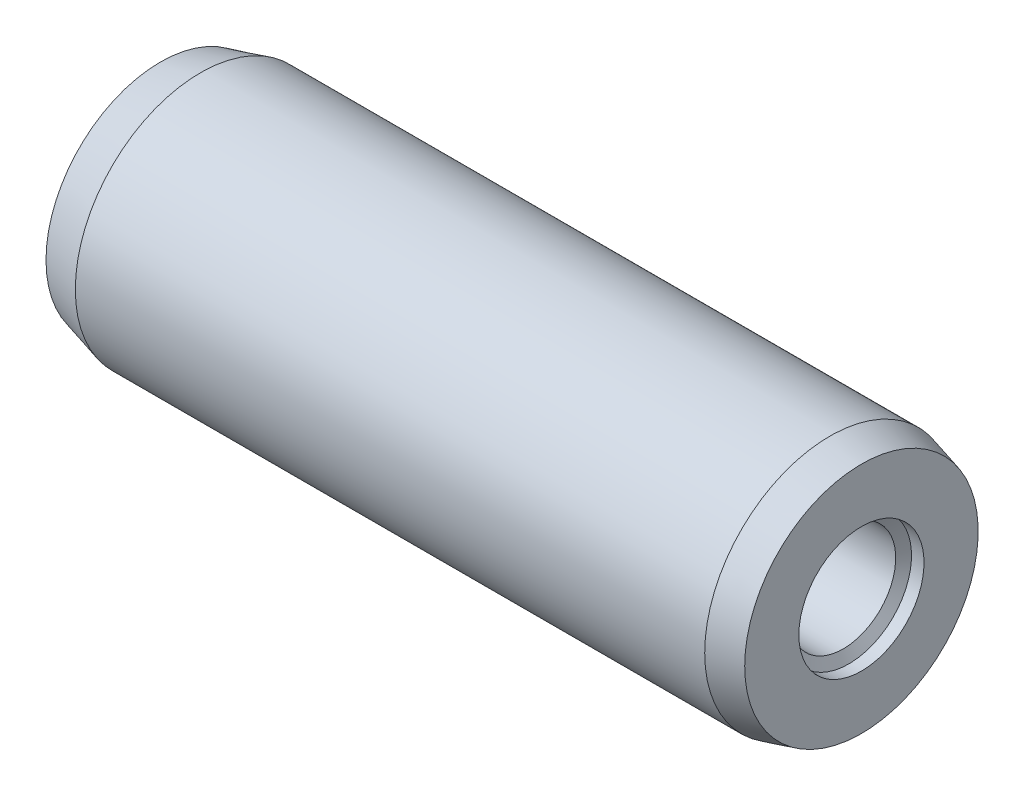
ISO-10303-21;
HEADER;
FILE_DESCRIPTION(('STEP AP214'),'2;1');
FILE_NAME('part.step','',(''),(''),'','','');
FILE_SCHEMA(('AUTOMOTIVE_DESIGN { 1 0 10303 214 1 1 1 1 }'));
ENDSEC;
DATA;
#1=APPLICATION_CONTEXT('core data for automotive mechanical design processes');
#2=APPLICATION_PROTOCOL_DEFINITION('international standard','automotive_design',2000,#1);
#3=PRODUCT_CONTEXT('',#1,'mechanical');
#4=PRODUCT('Part','Part','',(#3));
#5=PRODUCT_RELATED_PRODUCT_CATEGORY('part','',(#4));
#6=PRODUCT_DEFINITION_FORMATION('','',#4);
#7=PRODUCT_DEFINITION_CONTEXT('part definition',#1,'design');
#8=PRODUCT_DEFINITION('design','',#6,#7);
#9=PRODUCT_DEFINITION_SHAPE('','',#8);
#10=(LENGTH_UNIT() NAMED_UNIT(*) SI_UNIT(.MILLI.,.METRE.));
#11=(NAMED_UNIT(*) PLANE_ANGLE_UNIT() SI_UNIT($,.RADIAN.));
#12=(NAMED_UNIT(*) SI_UNIT($,.STERADIAN.) SOLID_ANGLE_UNIT());
#13=UNCERTAINTY_MEASURE_WITH_UNIT(LENGTH_MEASURE(1.E-05),#10,'distance_accuracy_value','');
#14=(GEOMETRIC_REPRESENTATION_CONTEXT(3) GLOBAL_UNCERTAINTY_ASSIGNED_CONTEXT((#13)) GLOBAL_UNIT_ASSIGNED_CONTEXT((#10,
#11,#12)) REPRESENTATION_CONTEXT('',''));
#15=CARTESIAN_POINT('',(0.,0.,0.));
#16=DIRECTION('',(0.,0.,1.));
#17=DIRECTION('',(1.,0.,0.));
#18=AXIS2_PLACEMENT_3D('',#15,#16,#17);
#19=CARTESIAN_POINT('',(0.,0.,0.));
#20=DIRECTION('',(1.,0.,0.));
#21=DIRECTION('',(0.,0.,-1.));
#22=AXIS2_PLACEMENT_3D('',#19,#20,#21);
#23=PLANE('',#22);
#24=CARTESIAN_POINT('',(0.,0.,0.));
#25=DIRECTION('',(-1.,0.,0.));
#26=DIRECTION('',(0.,0.,1.));
#27=AXIS2_PLACEMENT_3D('',#24,#25,#26);
#28=CIRCLE('',#27,22.8564064605511);
#29=CARTESIAN_POINT('',(0.,0.,22.8564064605511));
#30=VERTEX_POINT('',#29);
#31=EDGE_CURVE('E11',#30,#30,#28,.T.);
#32=ORIENTED_EDGE('',*,*,#31,.T.);
#33=EDGE_LOOP('',(#32));
#34=FACE_BOUND('',#33,.T.);
#35=ADVANCED_FACE('F34',(#34),#23,.F.);
#36=CARTESIAN_POINT('',(8.,0.,0.));
#37=DIRECTION('',(1.,0.,0.));
#38=DIRECTION('',(0.,0.,-1.));
#39=AXIS2_PLACEMENT_3D('',#36,#37,#38);
#40=CONICAL_SURFACE('',#39,25.,0.261799387799143);
#41=ORIENTED_EDGE('',*,*,#31,.F.);
#42=EDGE_LOOP('',(#41));
#43=FACE_BOUND('',#42,.T.);
#44=CARTESIAN_POINT('',(8.,0.,0.));
#45=DIRECTION('',(-1.,0.,0.));
#46=DIRECTION('',(0.,0.,1.));
#47=AXIS2_PLACEMENT_3D('',#44,#45,#46);
#48=CIRCLE('',#47,25.);
#49=CARTESIAN_POINT('',(8.,0.,25.));
#50=VERTEX_POINT('',#49);
#51=EDGE_CURVE('E40',#50,#50,#48,.T.);
#52=ORIENTED_EDGE('',*,*,#51,.T.);
#53=EDGE_LOOP('',(#52));
#54=FACE_BOUND('',#53,.T.);
#55=ADVANCED_FACE('F56',(#43,#54),#40,.T.);
#56=CARTESIAN_POINT('',(-10.,0.,0.));
#57=DIRECTION('',(-1.,0.,0.));
#58=DIRECTION('',(0.,0.,1.));
#59=AXIS2_PLACEMENT_3D('',#56,#57,#58);
#60=CYLINDRICAL_SURFACE('',#59,25.);
#61=ORIENTED_EDGE('',*,*,#51,.F.);
#62=EDGE_LOOP('',(#61));
#63=FACE_BOUND('',#62,.T.);
#64=CARTESIAN_POINT('',(133.7,0.,0.));
#65=DIRECTION('',(-1.,0.,0.));
#66=DIRECTION('',(0.,0.,1.));
#67=AXIS2_PLACEMENT_3D('',#64,#65,#66);
#68=CIRCLE('',#67,25.);
#69=CARTESIAN_POINT('',(133.7,0.,25.));
#70=VERTEX_POINT('',#69);
#71=EDGE_CURVE('E68',#70,#70,#68,.T.);
#72=ORIENTED_EDGE('',*,*,#71,.T.);
#73=EDGE_LOOP('',(#72));
#74=FACE_BOUND('',#73,.T.);
#75=ADVANCED_FACE('F61',(#63,#74),#60,.T.);
#76=CARTESIAN_POINT('',(140.,0.,0.));
#77=DIRECTION('',(-1.,0.,0.));
#78=DIRECTION('',(0.,0.,1.));
#79=AXIS2_PLACEMENT_3D('',#76,#77,#78);
#80=CONICAL_SURFACE('',#79,23.3119200876839,0.261799387799153);
#81=ORIENTED_EDGE('',*,*,#71,.F.);
#82=EDGE_LOOP('',(#81));
#83=FACE_BOUND('',#82,.T.);
#84=CARTESIAN_POINT('',(140.,0.,0.));
#85=DIRECTION('',(-1.,0.,0.));
#86=DIRECTION('',(0.,0.,1.));
#87=AXIS2_PLACEMENT_3D('',#84,#85,#86);
#88=CIRCLE('',#87,23.3119200876839);
#89=CARTESIAN_POINT('',(140.,0.,23.3119200876839));
#90=VERTEX_POINT('',#89);
#91=EDGE_CURVE('E70',#90,#90,#88,.T.);
#92=ORIENTED_EDGE('',*,*,#91,.T.);
#93=EDGE_LOOP('',(#92));
#94=FACE_BOUND('',#93,.T.);
#95=ADVANCED_FACE('F103',(#83,#94),#80,.T.);
#96=CARTESIAN_POINT('',(140.,23.3119200876839,0.));
#97=DIRECTION('',(-1.,0.,0.));
#98=DIRECTION('',(0.,0.,1.));
#99=AXIS2_PLACEMENT_3D('',#96,#97,#98);
#100=PLANE('',#99);
#101=ORIENTED_EDGE('',*,*,#91,.F.);
#102=EDGE_LOOP('',(#101));
#103=FACE_BOUND('',#102,.T.);
#104=CARTESIAN_POINT('',(140.,0.,0.));
#105=DIRECTION('',(-1.,0.,0.));
#106=DIRECTION('',(0.,0.,1.));
#107=AXIS2_PLACEMENT_3D('',#104,#105,#106);
#108=CIRCLE('',#107,12.5);
#109=CARTESIAN_POINT('',(140.,0.,12.5));
#110=VERTEX_POINT('',#109);
#111=EDGE_CURVE('E75',#110,#110,#108,.T.);
#112=ORIENTED_EDGE('',*,*,#111,.T.);
#113=EDGE_LOOP('',(#112));
#114=FACE_BOUND('',#113,.T.);
#115=ADVANCED_FACE('F96',(#103,#114),#100,.F.);
#116=CARTESIAN_POINT('',(-10.,0.,0.));
#117=DIRECTION('',(-1.,0.,0.));
#118=DIRECTION('',(0.,0.,1.));
#119=AXIS2_PLACEMENT_3D('',#116,#117,#118);
#120=CYLINDRICAL_SURFACE('',#119,12.5);
#121=ORIENTED_EDGE('',*,*,#111,.F.);
#122=EDGE_LOOP('',(#121));
#123=FACE_BOUND('',#122,.T.);
#124=CARTESIAN_POINT('',(137.5,0.,0.));
#125=DIRECTION('',(-1.,0.,0.));
#126=DIRECTION('',(0.,0.,1.));
#127=AXIS2_PLACEMENT_3D('',#124,#125,#126);
#128=CIRCLE('',#127,12.5);
#129=CARTESIAN_POINT('',(137.5,0.,12.5));
#130=VERTEX_POINT('',#129);
#131=EDGE_CURVE('E78',#130,#130,#128,.T.);
#132=ORIENTED_EDGE('',*,*,#131,.T.);
#133=EDGE_LOOP('',(#132));
#134=FACE_BOUND('',#133,.T.);
#135=ADVANCED_FACE('F90',(#123,#134),#120,.F.);
#136=CARTESIAN_POINT('',(136.345299461621,0.,0.));
#137=DIRECTION('',(1.,0.,0.));
#138=DIRECTION('',(0.,0.,-1.));
#139=AXIS2_PLACEMENT_3D('',#136,#137,#138);
#140=CONICAL_SURFACE('',#139,10.5,1.0471975511966);
#141=ORIENTED_EDGE('',*,*,#131,.F.);
#142=EDGE_LOOP('',(#141));
#143=FACE_BOUND('',#142,.T.);
#144=CARTESIAN_POINT('',(136.345299461621,0.,0.));
#145=DIRECTION('',(-1.,0.,0.));
#146=DIRECTION('',(0.,0.,1.));
#147=AXIS2_PLACEMENT_3D('',#144,#145,#146);
#148=CIRCLE('',#147,10.5);
#149=CARTESIAN_POINT('',(136.345299461621,0.,10.5));
#150=VERTEX_POINT('',#149);
#151=EDGE_CURVE('E81',#150,#150,#148,.T.);
#152=ORIENTED_EDGE('',*,*,#151,.T.);
#153=EDGE_LOOP('',(#152));
#154=FACE_BOUND('',#153,.T.);
#155=ADVANCED_FACE('F51',(#143,#154),#140,.F.);
#156=CARTESIAN_POINT('',(-10.,0.,0.));
#157=DIRECTION('',(-1.,0.,0.));
#158=DIRECTION('',(0.,0.,1.));
#159=AXIS2_PLACEMENT_3D('',#156,#157,#158);
#160=CYLINDRICAL_SURFACE('',#159,10.5);
#161=ORIENTED_EDGE('',*,*,#151,.F.);
#162=EDGE_LOOP('',(#161));
#163=FACE_BOUND('',#162,.T.);
#164=CARTESIAN_POINT('',(90.,0.,0.));
#165=DIRECTION('',(-1.,0.,0.));
#166=DIRECTION('',(0.,0.,1.));
#167=AXIS2_PLACEMENT_3D('',#164,#165,#166);
#168=CIRCLE('',#167,10.5);
#169=CARTESIAN_POINT('',(90.,0.,10.5));
#170=VERTEX_POINT('',#169);
#171=EDGE_CURVE('E84',#170,#170,#168,.T.);
#172=ORIENTED_EDGE('',*,*,#171,.T.);
#173=EDGE_LOOP('',(#172));
#174=FACE_BOUND('',#173,.T.);
#175=ADVANCED_FACE('F45',(#163,#174),#160,.F.);
#176=CARTESIAN_POINT('',(83.6909635002106,0.,0.));
#177=DIRECTION('',(1.,0.,0.));
#178=DIRECTION('',(0.,0.,-1.));
#179=AXIS2_PLACEMENT_3D('',#176,#177,#178);
#180=CONICAL_SURFACE('',#179,0.,1.02974425867666);
#181=ORIENTED_EDGE('',*,*,#171,.F.);
#182=EDGE_LOOP('',(#181));
#183=FACE_BOUND('',#182,.T.);
#184=CARTESIAN_POINT('',(83.6909635002106,0.,0.));
#185=VERTEX_POINT('',#184);
#186=VERTEX_LOOP('',#185);
#187=FACE_BOUND('',#186,.T.);
#188=ADVANCED_FACE('F43',(#183,#187),#180,.F.);
#189=CLOSED_SHELL('',(#35,#55,#75,#95,#115,#135,#155,#175,#188));
#190=MANIFOLD_SOLID_BREP('B2',#189);
#191=ADVANCED_BREP_SHAPE_REPRESENTATION('',(#18,#190),#14);
#192=SHAPE_DEFINITION_REPRESENTATION(#9,#191);
ENDSEC;
END-ISO-10303-21;
